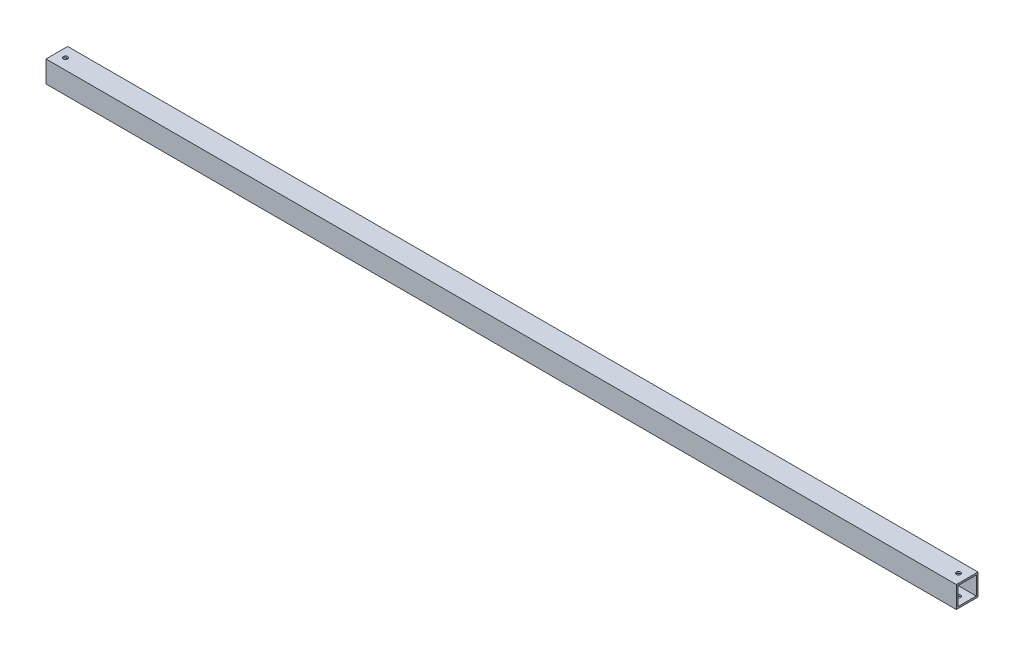
ISO-10303-21;
HEADER;
FILE_DESCRIPTION(('STEP AP214'),'2;1');
FILE_NAME('part.step','',(''),(''),'','','');
FILE_SCHEMA(('AUTOMOTIVE_DESIGN { 1 0 10303 214 1 1 1 1 }'));
ENDSEC;
DATA;
#1=APPLICATION_CONTEXT('core data for automotive mechanical design processes');
#2=APPLICATION_PROTOCOL_DEFINITION('international standard','automotive_design',2000,#1);
#3=PRODUCT_CONTEXT('',#1,'mechanical');
#4=PRODUCT('Part','Part','',(#3));
#5=PRODUCT_RELATED_PRODUCT_CATEGORY('part','',(#4));
#6=PRODUCT_DEFINITION_FORMATION('','',#4);
#7=PRODUCT_DEFINITION_CONTEXT('part definition',#1,'design');
#8=PRODUCT_DEFINITION('design','',#6,#7);
#9=PRODUCT_DEFINITION_SHAPE('','',#8);
#10=(LENGTH_UNIT() NAMED_UNIT(*) SI_UNIT(.MILLI.,.METRE.));
#11=(NAMED_UNIT(*) PLANE_ANGLE_UNIT() SI_UNIT($,.RADIAN.));
#12=(NAMED_UNIT(*) SI_UNIT($,.STERADIAN.) SOLID_ANGLE_UNIT());
#13=UNCERTAINTY_MEASURE_WITH_UNIT(LENGTH_MEASURE(1.E-05),#10,'distance_accuracy_value','');
#14=(GEOMETRIC_REPRESENTATION_CONTEXT(3) GLOBAL_UNCERTAINTY_ASSIGNED_CONTEXT((#13)) GLOBAL_UNIT_ASSIGNED_CONTEXT((#10,
#11,#12)) REPRESENTATION_CONTEXT('',''));
#15=CARTESIAN_POINT('',(0.,0.,0.));
#16=DIRECTION('',(0.,0.,1.));
#17=DIRECTION('',(1.,0.,0.));
#18=AXIS2_PLACEMENT_3D('',#15,#16,#17);
#19=CARTESIAN_POINT('',(624.,0.,7.5));
#20=DIRECTION('',(0.,1.,0.));
#21=DIRECTION('',(0.,0.,1.));
#22=AXIS2_PLACEMENT_3D('',#19,#20,#21);
#23=CYLINDRICAL_SURFACE('',#22,1.49999999999997);
#24=CARTESIAN_POINT('',(624.,13.8,7.5));
#25=DIRECTION('',(0.,1.,0.));
#26=DIRECTION('',(0.,0.,1.));
#27=AXIS2_PLACEMENT_3D('',#24,#25,#26);
#28=CIRCLE('',#27,1.49999999999997);
#29=CARTESIAN_POINT('',(624.,13.8,8.99999999999997));
#30=VERTEX_POINT('',#29);
#31=EDGE_CURVE('E167',#30,#30,#28,.F.);
#32=ORIENTED_EDGE('',*,*,#31,.T.);
#33=EDGE_LOOP('',(#32));
#34=FACE_BOUND('',#33,.T.);
#35=CARTESIAN_POINT('',(624.,15.,7.5));
#36=DIRECTION('',(0.,1.,0.));
#37=DIRECTION('',(0.,0.,1.));
#38=AXIS2_PLACEMENT_3D('',#35,#36,#37);
#39=CIRCLE('',#38,1.49999999999997);
#40=CARTESIAN_POINT('',(624.,15.,8.99999999999997));
#41=VERTEX_POINT('',#40);
#42=EDGE_CURVE('E181',#41,#41,#39,.T.);
#43=ORIENTED_EDGE('',*,*,#42,.T.);
#44=EDGE_LOOP('',(#43));
#45=FACE_BOUND('',#44,.T.);
#46=ADVANCED_FACE('F45',(#34,#45),#23,.F.);
#47=CARTESIAN_POINT('',(6.,0.,7.50000000000007));
#48=DIRECTION('',(0.,1.,0.));
#49=DIRECTION('',(0.,0.,1.));
#50=AXIS2_PLACEMENT_3D('',#47,#48,#49);
#51=CYLINDRICAL_SURFACE('',#50,1.5);
#52=CARTESIAN_POINT('',(6.,13.8,7.50000000000007));
#53=DIRECTION('',(0.,1.,0.));
#54=DIRECTION('',(0.,0.,1.));
#55=AXIS2_PLACEMENT_3D('',#52,#53,#54);
#56=CIRCLE('',#55,1.5);
#57=CARTESIAN_POINT('',(6.,13.8,9.00000000000007));
#58=VERTEX_POINT('',#57);
#59=EDGE_CURVE('E49',#58,#58,#56,.F.);
#60=ORIENTED_EDGE('',*,*,#59,.T.);
#61=EDGE_LOOP('',(#60));
#62=FACE_BOUND('',#61,.T.);
#63=CARTESIAN_POINT('',(6.,15.,7.50000000000007));
#64=DIRECTION('',(0.,1.,0.));
#65=DIRECTION('',(0.,0.,1.));
#66=AXIS2_PLACEMENT_3D('',#63,#64,#65);
#67=CIRCLE('',#66,1.5);
#68=CARTESIAN_POINT('',(6.,15.,9.00000000000007));
#69=VERTEX_POINT('',#68);
#70=EDGE_CURVE('E177',#69,#69,#67,.T.);
#71=ORIENTED_EDGE('',*,*,#70,.T.);
#72=EDGE_LOOP('',(#71));
#73=FACE_BOUND('',#72,.T.);
#74=ADVANCED_FACE('F276',(#62,#73),#51,.F.);
#75=CARTESIAN_POINT('',(0.,0.,15.));
#76=DIRECTION('',(1.,0.,0.));
#77=DIRECTION('',(0.,0.,-1.));
#78=AXIS2_PLACEMENT_3D('',#75,#76,#77);
#79=PLANE('',#78);
#80=DIRECTION('',(0.,-1.,0.));
#81=VECTOR('',#80,1.);
#82=CARTESIAN_POINT('',(0.,13.8,1.2));
#83=LINE('',#82,#81);
#84=CARTESIAN_POINT('',(0.,13.8,1.2));
#85=VERTEX_POINT('',#84);
#86=CARTESIAN_POINT('',(0.,1.2,1.2));
#87=VERTEX_POINT('',#86);
#88=EDGE_CURVE('E148',#85,#87,#83,.T.);
#89=ORIENTED_EDGE('',*,*,#88,.F.);
#90=DIRECTION('',(0.,0.,-1.));
#91=VECTOR('',#90,1.);
#92=CARTESIAN_POINT('',(0.,13.8,13.8));
#93=LINE('',#92,#91);
#94=CARTESIAN_POINT('',(0.,13.8,13.8));
#95=VERTEX_POINT('',#94);
#96=EDGE_CURVE('E63',#95,#85,#93,.T.);
#97=ORIENTED_EDGE('',*,*,#96,.F.);
#98=DIRECTION('',(0.,1.,0.));
#99=VECTOR('',#98,1.);
#100=CARTESIAN_POINT('',(0.,1.2,13.8));
#101=LINE('',#100,#99);
#102=CARTESIAN_POINT('',(0.,1.2,13.8));
#103=VERTEX_POINT('',#102);
#104=EDGE_CURVE('E135',#103,#95,#101,.T.);
#105=ORIENTED_EDGE('',*,*,#104,.F.);
#106=DIRECTION('',(0.,0.,1.));
#107=VECTOR('',#106,1.);
#108=CARTESIAN_POINT('',(0.,1.2,1.2));
#109=LINE('',#108,#107);
#110=EDGE_CURVE('E139',#87,#103,#109,.T.);
#111=ORIENTED_EDGE('',*,*,#110,.F.);
#112=EDGE_LOOP('',(#89,#97,#105,#111));
#113=FACE_BOUND('',#112,.T.);
#114=DIRECTION('',(0.,-1.,0.));
#115=VECTOR('',#114,1.);
#116=CARTESIAN_POINT('',(0.,0.,0.));
#117=LINE('',#116,#115);
#118=CARTESIAN_POINT('',(0.,15.,0.));
#119=VERTEX_POINT('',#118);
#120=CARTESIAN_POINT('',(0.,0.,0.));
#121=VERTEX_POINT('',#120);
#122=EDGE_CURVE('E176',#119,#121,#117,.T.);
#123=ORIENTED_EDGE('',*,*,#122,.T.);
#124=DIRECTION('',(0.,0.,-1.));
#125=VECTOR('',#124,1.);
#126=CARTESIAN_POINT('',(0.,0.,15.));
#127=LINE('',#126,#125);
#128=CARTESIAN_POINT('',(0.,0.,15.));
#129=VERTEX_POINT('',#128);
#130=EDGE_CURVE('E11',#129,#121,#127,.T.);
#131=ORIENTED_EDGE('',*,*,#130,.F.);
#132=DIRECTION('',(0.,-1.,0.));
#133=VECTOR('',#132,1.);
#134=CARTESIAN_POINT('',(0.,0.,15.));
#135=LINE('',#134,#133);
#136=CARTESIAN_POINT('',(0.,15.,15.));
#137=VERTEX_POINT('',#136);
#138=EDGE_CURVE('E188',#137,#129,#135,.T.);
#139=ORIENTED_EDGE('',*,*,#138,.F.);
#140=DIRECTION('',(0.,0.,-1.));
#141=VECTOR('',#140,1.);
#142=CARTESIAN_POINT('',(0.,15.,15.));
#143=LINE('',#142,#141);
#144=EDGE_CURVE('E202',#137,#119,#143,.T.);
#145=ORIENTED_EDGE('',*,*,#144,.T.);
#146=EDGE_LOOP('',(#123,#131,#139,#145));
#147=FACE_BOUND('',#146,.T.);
#148=ADVANCED_FACE('F47',(#113,#147),#79,.F.);
#149=CARTESIAN_POINT('',(0.,0.,15.));
#150=DIRECTION('',(0.,1.,0.));
#151=DIRECTION('',(0.,0.,1.));
#152=AXIS2_PLACEMENT_3D('',#149,#150,#151);
#153=PLANE('',#152);
#154=CARTESIAN_POINT('',(6.,0.,7.50000000000007));
#155=DIRECTION('',(0.,1.,0.));
#156=DIRECTION('',(0.,0.,1.));
#157=AXIS2_PLACEMENT_3D('',#154,#155,#156);
#158=CIRCLE('',#157,1.5);
#159=CARTESIAN_POINT('',(6.,0.,9.00000000000007));
#160=VERTEX_POINT('',#159);
#161=EDGE_CURVE('E172',#160,#160,#158,.T.);
#162=ORIENTED_EDGE('',*,*,#161,.T.);
#163=EDGE_LOOP('',(#162));
#164=FACE_BOUND('',#163,.T.);
#165=CARTESIAN_POINT('',(624.,0.,7.5));
#166=DIRECTION('',(0.,1.,0.));
#167=DIRECTION('',(0.,0.,1.));
#168=AXIS2_PLACEMENT_3D('',#165,#166,#167);
#169=CIRCLE('',#168,1.49999999999997);
#170=CARTESIAN_POINT('',(624.,0.,8.99999999999997));
#171=VERTEX_POINT('',#170);
#172=EDGE_CURVE('E171',#171,#171,#169,.T.);
#173=ORIENTED_EDGE('',*,*,#172,.T.);
#174=EDGE_LOOP('',(#173));
#175=FACE_BOUND('',#174,.T.);
#176=DIRECTION('',(1.,0.,0.));
#177=VECTOR('',#176,1.);
#178=CARTESIAN_POINT('',(0.,0.,0.));
#179=LINE('',#178,#177);
#180=CARTESIAN_POINT('',(630.,0.,0.));
#181=VERTEX_POINT('',#180);
#182=EDGE_CURVE('E206',#121,#181,#179,.T.);
#183=ORIENTED_EDGE('',*,*,#182,.T.);
#184=DIRECTION('',(0.,0.,-1.));
#185=VECTOR('',#184,1.);
#186=CARTESIAN_POINT('',(630.,0.,15.));
#187=LINE('',#186,#185);
#188=CARTESIAN_POINT('',(630.,0.,15.));
#189=VERTEX_POINT('',#188);
#190=EDGE_CURVE('E55',#189,#181,#187,.T.);
#191=ORIENTED_EDGE('',*,*,#190,.F.);
#192=DIRECTION('',(1.,0.,0.));
#193=VECTOR('',#192,1.);
#194=CARTESIAN_POINT('',(0.,0.,15.));
#195=LINE('',#194,#193);
#196=EDGE_CURVE('E192',#129,#189,#195,.T.);
#197=ORIENTED_EDGE('',*,*,#196,.F.);
#198=ORIENTED_EDGE('',*,*,#130,.T.);
#199=EDGE_LOOP('',(#183,#191,#197,#198));
#200=FACE_BOUND('',#199,.T.);
#201=ADVANCED_FACE('F246',(#164,#175,#200),#153,.F.);
#202=CARTESIAN_POINT('',(630.,0.,15.));
#203=DIRECTION('',(-1.,0.,0.));
#204=DIRECTION('',(0.,0.,1.));
#205=AXIS2_PLACEMENT_3D('',#202,#203,#204);
#206=PLANE('',#205);
#207=DIRECTION('',(0.,1.,0.));
#208=VECTOR('',#207,1.);
#209=CARTESIAN_POINT('',(630.,1.2,13.8));
#210=LINE('',#209,#208);
#211=CARTESIAN_POINT('',(630.,1.2,13.8));
#212=VERTEX_POINT('',#211);
#213=CARTESIAN_POINT('',(630.,13.8,13.8));
#214=VERTEX_POINT('',#213);
#215=EDGE_CURVE('E123',#212,#214,#210,.T.);
#216=ORIENTED_EDGE('',*,*,#215,.T.);
#217=DIRECTION('',(0.,0.,-1.));
#218=VECTOR('',#217,1.);
#219=CARTESIAN_POINT('',(630.,13.8,13.8));
#220=LINE('',#219,#218);
#221=CARTESIAN_POINT('',(630.,13.8,1.2));
#222=VERTEX_POINT('',#221);
#223=EDGE_CURVE('E116',#214,#222,#220,.T.);
#224=ORIENTED_EDGE('',*,*,#223,.T.);
#225=DIRECTION('',(0.,-1.,0.));
#226=VECTOR('',#225,1.);
#227=CARTESIAN_POINT('',(630.,13.8,1.2));
#228=LINE('',#227,#226);
#229=CARTESIAN_POINT('',(630.,1.2,1.2));
#230=VERTEX_POINT('',#229);
#231=EDGE_CURVE('E126',#222,#230,#228,.T.);
#232=ORIENTED_EDGE('',*,*,#231,.T.);
#233=DIRECTION('',(0.,0.,1.));
#234=VECTOR('',#233,1.);
#235=CARTESIAN_POINT('',(630.,1.2,1.2));
#236=LINE('',#235,#234);
#237=EDGE_CURVE('E71',#230,#212,#236,.T.);
#238=ORIENTED_EDGE('',*,*,#237,.T.);
#239=EDGE_LOOP('',(#216,#224,#232,#238));
#240=FACE_BOUND('',#239,.T.);
#241=DIRECTION('',(0.,1.,0.));
#242=VECTOR('',#241,1.);
#243=CARTESIAN_POINT('',(630.,0.,0.));
#244=LINE('',#243,#242);
#245=CARTESIAN_POINT('',(630.,15.,0.));
#246=VERTEX_POINT('',#245);
#247=EDGE_CURVE('E209',#181,#246,#244,.T.);
#248=ORIENTED_EDGE('',*,*,#247,.T.);
#249=DIRECTION('',(0.,0.,-1.));
#250=VECTOR('',#249,1.);
#251=CARTESIAN_POINT('',(630.,15.,15.));
#252=LINE('',#251,#250);
#253=CARTESIAN_POINT('',(630.,15.,15.));
#254=VERTEX_POINT('',#253);
#255=EDGE_CURVE('E217',#254,#246,#252,.T.);
#256=ORIENTED_EDGE('',*,*,#255,.F.);
#257=DIRECTION('',(0.,1.,0.));
#258=VECTOR('',#257,1.);
#259=CARTESIAN_POINT('',(630.,0.,15.));
#260=LINE('',#259,#258);
#261=EDGE_CURVE('E196',#189,#254,#260,.T.);
#262=ORIENTED_EDGE('',*,*,#261,.F.);
#263=ORIENTED_EDGE('',*,*,#190,.T.);
#264=EDGE_LOOP('',(#248,#256,#262,#263));
#265=FACE_BOUND('',#264,.T.);
#266=ADVANCED_FACE('F131',(#240,#265),#206,.F.);
#267=CARTESIAN_POINT('',(0.,15.,15.));
#268=DIRECTION('',(0.,-1.,0.));
#269=DIRECTION('',(0.,0.,-1.));
#270=AXIS2_PLACEMENT_3D('',#267,#268,#269);
#271=PLANE('',#270);
#272=ORIENTED_EDGE('',*,*,#70,.F.);
#273=EDGE_LOOP('',(#272));
#274=FACE_BOUND('',#273,.T.);
#275=ORIENTED_EDGE('',*,*,#42,.F.);
#276=EDGE_LOOP('',(#275));
#277=FACE_BOUND('',#276,.T.);
#278=DIRECTION('',(-1.,0.,0.));
#279=VECTOR('',#278,1.);
#280=CARTESIAN_POINT('',(0.,15.,0.));
#281=LINE('',#280,#279);
#282=EDGE_CURVE('E193',#246,#119,#281,.T.);
#283=ORIENTED_EDGE('',*,*,#282,.T.);
#284=ORIENTED_EDGE('',*,*,#144,.F.);
#285=DIRECTION('',(-1.,0.,0.));
#286=VECTOR('',#285,1.);
#287=CARTESIAN_POINT('',(0.,15.,15.));
#288=LINE('',#287,#286);
#289=EDGE_CURVE('E199',#254,#137,#288,.T.);
#290=ORIENTED_EDGE('',*,*,#289,.F.);
#291=ORIENTED_EDGE('',*,*,#255,.T.);
#292=EDGE_LOOP('',(#283,#284,#290,#291));
#293=FACE_BOUND('',#292,.T.);
#294=ADVANCED_FACE('F260',(#274,#277,#293),#271,.F.);
#295=CARTESIAN_POINT('',(0.,0.,15.));
#296=DIRECTION('',(0.,0.,-1.));
#297=DIRECTION('',(-1.,0.,0.));
#298=AXIS2_PLACEMENT_3D('',#295,#296,#297);
#299=PLANE('',#298);
#300=ORIENTED_EDGE('',*,*,#138,.T.);
#301=ORIENTED_EDGE('',*,*,#196,.T.);
#302=ORIENTED_EDGE('',*,*,#261,.T.);
#303=ORIENTED_EDGE('',*,*,#289,.T.);
#304=EDGE_LOOP('',(#300,#301,#302,#303));
#305=FACE_BOUND('',#304,.T.);
#306=ADVANCED_FACE('F265',(#305),#299,.F.);
#307=CARTESIAN_POINT('',(0.,0.,0.));
#308=DIRECTION('',(0.,0.,-1.));
#309=DIRECTION('',(-1.,0.,0.));
#310=AXIS2_PLACEMENT_3D('',#307,#308,#309);
#311=PLANE('',#310);
#312=ORIENTED_EDGE('',*,*,#122,.F.);
#313=ORIENTED_EDGE('',*,*,#282,.F.);
#314=ORIENTED_EDGE('',*,*,#247,.F.);
#315=ORIENTED_EDGE('',*,*,#182,.F.);
#316=EDGE_LOOP('',(#312,#313,#314,#315));
#317=FACE_BOUND('',#316,.T.);
#318=ADVANCED_FACE('F242',(#317),#311,.T.);
#319=CARTESIAN_POINT('',(624.,1.2,7.5));
#320=DIRECTION('',(0.,-1.,0.));
#321=DIRECTION('',(0.,0.,-1.));
#322=AXIS2_PLACEMENT_3D('',#319,#320,#321);
#323=CIRCLE('',#322,1.49999999999997);
#324=CARTESIAN_POINT('',(624.,1.2,6.00000000000003));
#325=VERTEX_POINT('',#324);
#326=EDGE_CURVE('E163',#325,#325,#323,.F.);
#327=ORIENTED_EDGE('',*,*,#326,.T.);
#328=EDGE_LOOP('',(#327));
#329=FACE_BOUND('',#328,.T.);
#330=ORIENTED_EDGE('',*,*,#172,.F.);
#331=EDGE_LOOP('',(#330));
#332=FACE_BOUND('',#331,.T.);
#333=ADVANCED_FACE('F239',(#329,#332),#23,.F.);
#334=CARTESIAN_POINT('',(6.,1.2,7.50000000000007));
#335=DIRECTION('',(0.,-1.,0.));
#336=DIRECTION('',(0.,0.,-1.));
#337=AXIS2_PLACEMENT_3D('',#334,#335,#336);
#338=CIRCLE('',#337,1.5);
#339=CARTESIAN_POINT('',(6.,1.2,6.00000000000007));
#340=VERTEX_POINT('',#339);
#341=EDGE_CURVE('E157',#340,#340,#338,.F.);
#342=ORIENTED_EDGE('',*,*,#341,.T.);
#343=EDGE_LOOP('',(#342));
#344=FACE_BOUND('',#343,.T.);
#345=ORIENTED_EDGE('',*,*,#161,.F.);
#346=EDGE_LOOP('',(#345));
#347=FACE_BOUND('',#346,.T.);
#348=ADVANCED_FACE('F227',(#344,#347),#51,.F.);
#349=CARTESIAN_POINT('',(630.,13.8,13.8));
#350=DIRECTION('',(0.,1.,0.));
#351=DIRECTION('',(0.,0.,1.));
#352=AXIS2_PLACEMENT_3D('',#349,#350,#351);
#353=PLANE('',#352);
#354=ORIENTED_EDGE('',*,*,#59,.F.);
#355=EDGE_LOOP('',(#354));
#356=FACE_BOUND('',#355,.T.);
#357=ORIENTED_EDGE('',*,*,#96,.T.);
#358=DIRECTION('',(-1.,0.,0.));
#359=VECTOR('',#358,1.);
#360=CARTESIAN_POINT('',(630.,13.8,1.2));
#361=LINE('',#360,#359);
#362=EDGE_CURVE('E111',#222,#85,#361,.T.);
#363=ORIENTED_EDGE('',*,*,#362,.F.);
#364=ORIENTED_EDGE('',*,*,#223,.F.);
#365=DIRECTION('',(-1.,0.,0.));
#366=VECTOR('',#365,1.);
#367=CARTESIAN_POINT('',(630.,13.8,13.8));
#368=LINE('',#367,#366);
#369=EDGE_CURVE('E154',#214,#95,#368,.T.);
#370=ORIENTED_EDGE('',*,*,#369,.T.);
#371=EDGE_LOOP('',(#357,#363,#364,#370));
#372=FACE_BOUND('',#371,.T.);
#373=ORIENTED_EDGE('',*,*,#31,.F.);
#374=EDGE_LOOP('',(#373));
#375=FACE_BOUND('',#374,.T.);
#376=ADVANCED_FACE('F113',(#356,#372,#375),#353,.F.);
#377=CARTESIAN_POINT('',(630.,1.2,1.2));
#378=DIRECTION('',(0.,-1.,0.));
#379=DIRECTION('',(0.,0.,-1.));
#380=AXIS2_PLACEMENT_3D('',#377,#378,#379);
#381=PLANE('',#380);
#382=ORIENTED_EDGE('',*,*,#341,.F.);
#383=EDGE_LOOP('',(#382));
#384=FACE_BOUND('',#383,.T.);
#385=ORIENTED_EDGE('',*,*,#110,.T.);
#386=DIRECTION('',(-1.,0.,0.));
#387=VECTOR('',#386,1.);
#388=CARTESIAN_POINT('',(630.,1.2,13.8));
#389=LINE('',#388,#387);
#390=EDGE_CURVE('E158',#212,#103,#389,.T.);
#391=ORIENTED_EDGE('',*,*,#390,.F.);
#392=ORIENTED_EDGE('',*,*,#237,.F.);
#393=DIRECTION('',(-1.,0.,0.));
#394=VECTOR('',#393,1.);
#395=CARTESIAN_POINT('',(630.,1.2,1.2));
#396=LINE('',#395,#394);
#397=EDGE_CURVE('E122',#230,#87,#396,.T.);
#398=ORIENTED_EDGE('',*,*,#397,.T.);
#399=EDGE_LOOP('',(#385,#391,#392,#398));
#400=FACE_BOUND('',#399,.T.);
#401=ORIENTED_EDGE('',*,*,#326,.F.);
#402=EDGE_LOOP('',(#401));
#403=FACE_BOUND('',#402,.T.);
#404=ADVANCED_FACE('F230',(#384,#400,#403),#381,.F.);
#405=CARTESIAN_POINT('',(630.,1.2,13.8));
#406=DIRECTION('',(0.,0.,1.));
#407=DIRECTION('',(1.,0.,0.));
#408=AXIS2_PLACEMENT_3D('',#405,#406,#407);
#409=PLANE('',#408);
#410=ORIENTED_EDGE('',*,*,#104,.T.);
#411=ORIENTED_EDGE('',*,*,#369,.F.);
#412=ORIENTED_EDGE('',*,*,#215,.F.);
#413=ORIENTED_EDGE('',*,*,#390,.T.);
#414=EDGE_LOOP('',(#410,#411,#412,#413));
#415=FACE_BOUND('',#414,.T.);
#416=ADVANCED_FACE('F232',(#415),#409,.F.);
#417=CARTESIAN_POINT('',(630.,13.8,1.2));
#418=DIRECTION('',(0.,0.,-1.));
#419=DIRECTION('',(-1.,0.,0.));
#420=AXIS2_PLACEMENT_3D('',#417,#418,#419);
#421=PLANE('',#420);
#422=ORIENTED_EDGE('',*,*,#88,.T.);
#423=ORIENTED_EDGE('',*,*,#397,.F.);
#424=ORIENTED_EDGE('',*,*,#231,.F.);
#425=ORIENTED_EDGE('',*,*,#362,.T.);
#426=EDGE_LOOP('',(#422,#423,#424,#425));
#427=FACE_BOUND('',#426,.T.);
#428=ADVANCED_FACE('F127',(#427),#421,.F.);
#429=CLOSED_SHELL('',(#46,#74,#148,#201,#266,#294,#306,#318,#333,#348,#376,#404,#416,#428));
#430=MANIFOLD_SOLID_BREP('B2',#429);
#431=ADVANCED_BREP_SHAPE_REPRESENTATION('',(#18,#430),#14);
#432=SHAPE_DEFINITION_REPRESENTATION(#9,#431);
ENDSEC;
END-ISO-10303-21;
